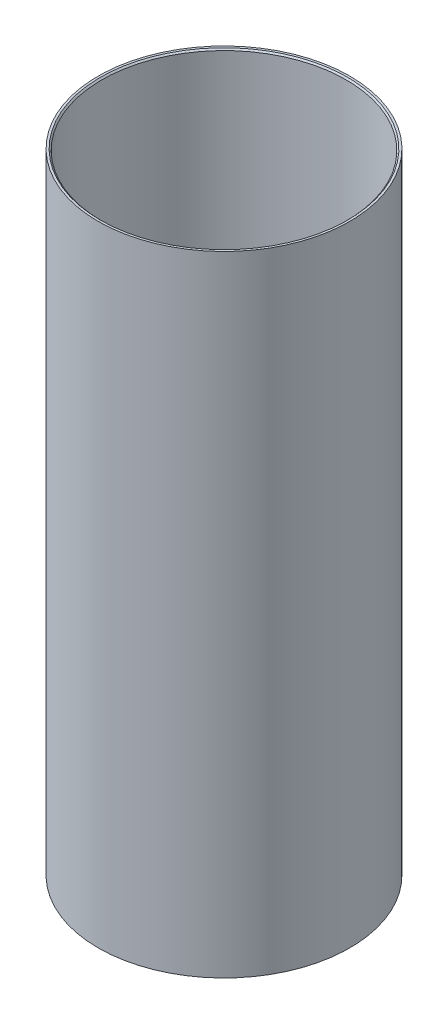
ISO-10303-21;
HEADER;
FILE_DESCRIPTION(('STEP AP214'),'2;1');
FILE_NAME('part.step','',(''),(''),'','','');
FILE_SCHEMA(('AUTOMOTIVE_DESIGN { 1 0 10303 214 1 1 1 1 }'));
ENDSEC;
DATA;
#1=APPLICATION_CONTEXT('core data for automotive mechanical design processes');
#2=APPLICATION_PROTOCOL_DEFINITION('international standard','automotive_design',2000,#1);
#3=PRODUCT_CONTEXT('',#1,'mechanical');
#4=PRODUCT('Part','Part','',(#3));
#5=PRODUCT_RELATED_PRODUCT_CATEGORY('part','',(#4));
#6=PRODUCT_DEFINITION_FORMATION('','',#4);
#7=PRODUCT_DEFINITION_CONTEXT('part definition',#1,'design');
#8=PRODUCT_DEFINITION('design','',#6,#7);
#9=PRODUCT_DEFINITION_SHAPE('','',#8);
#10=(LENGTH_UNIT() NAMED_UNIT(*) SI_UNIT(.MILLI.,.METRE.));
#11=(NAMED_UNIT(*) PLANE_ANGLE_UNIT() SI_UNIT($,.RADIAN.));
#12=(NAMED_UNIT(*) SI_UNIT($,.STERADIAN.) SOLID_ANGLE_UNIT());
#13=UNCERTAINTY_MEASURE_WITH_UNIT(LENGTH_MEASURE(1.E-05),#10,'distance_accuracy_value','');
#14=(GEOMETRIC_REPRESENTATION_CONTEXT(3) GLOBAL_UNCERTAINTY_ASSIGNED_CONTEXT((#13)) GLOBAL_UNIT_ASSIGNED_CONTEXT((#10,
#11,#12)) REPRESENTATION_CONTEXT('',''));
#15=CARTESIAN_POINT('',(0.,0.,0.));
#16=DIRECTION('',(0.,0.,1.));
#17=DIRECTION('',(1.,0.,0.));
#18=AXIS2_PLACEMENT_3D('',#15,#16,#17);
#19=CARTESIAN_POINT('',(0.,87.5,0.));
#20=DIRECTION('',(0.,-1.,0.));
#21=DIRECTION('',(0.,0.,-1.));
#22=AXIS2_PLACEMENT_3D('',#19,#20,#21);
#23=CYLINDRICAL_SURFACE('',#22,17.5);
#24=CARTESIAN_POINT('',(0.,87.5,0.));
#25=DIRECTION('',(0.,1.,0.));
#26=DIRECTION('',(0.,0.,1.));
#27=AXIS2_PLACEMENT_3D('',#24,#25,#26);
#28=CIRCLE('',#27,17.5);
#29=CARTESIAN_POINT('',(0.,87.5,17.5));
#30=VERTEX_POINT('',#29);
#31=EDGE_CURVE('E66',#30,#30,#28,.T.);
#32=ORIENTED_EDGE('',*,*,#31,.F.);
#33=EDGE_LOOP('',(#32));
#34=FACE_BOUND('',#33,.T.);
#35=CARTESIAN_POINT('',(0.,0.,0.));
#36=DIRECTION('',(0.,1.,0.));
#37=DIRECTION('',(0.,0.,1.));
#38=AXIS2_PLACEMENT_3D('',#35,#36,#37);
#39=CIRCLE('',#38,17.5);
#40=CARTESIAN_POINT('',(0.,0.,17.5));
#41=VERTEX_POINT('',#40);
#42=EDGE_CURVE('E67',#41,#41,#39,.T.);
#43=ORIENTED_EDGE('',*,*,#42,.T.);
#44=EDGE_LOOP('',(#43));
#45=FACE_BOUND('',#44,.T.);
#46=ADVANCED_FACE('F41',(#34,#45),#23,.T.);
#47=CARTESIAN_POINT('',(0.,87.5,0.));
#48=DIRECTION('',(0.,1.,0.));
#49=DIRECTION('',(0.,0.,1.));
#50=AXIS2_PLACEMENT_3D('',#47,#48,#49);
#51=PLANE('',#50);
#52=CARTESIAN_POINT('',(0.,87.5,0.));
#53=DIRECTION('',(0.,1.,0.));
#54=DIRECTION('',(0.,0.,1.));
#55=AXIS2_PLACEMENT_3D('',#52,#53,#54);
#56=CIRCLE('',#55,17.2);
#57=CARTESIAN_POINT('',(0.,87.5,17.2));
#58=VERTEX_POINT('',#57);
#59=EDGE_CURVE('E50',#58,#58,#56,.F.);
#60=ORIENTED_EDGE('',*,*,#59,.T.);
#61=EDGE_LOOP('',(#60));
#62=FACE_BOUND('',#61,.T.);
#63=ORIENTED_EDGE('',*,*,#31,.T.);
#64=EDGE_LOOP('',(#63));
#65=FACE_BOUND('',#64,.T.);
#66=ADVANCED_FACE('F75',(#62,#65),#51,.T.);
#67=CARTESIAN_POINT('',(0.,0.,0.));
#68=DIRECTION('',(0.,1.,0.));
#69=DIRECTION('',(0.,0.,1.));
#70=AXIS2_PLACEMENT_3D('',#67,#68,#69);
#71=PLANE('',#70);
#72=CARTESIAN_POINT('',(0.,0.,0.));
#73=DIRECTION('',(0.,1.,0.));
#74=DIRECTION('',(0.,0.,1.));
#75=AXIS2_PLACEMENT_3D('',#72,#73,#74);
#76=CIRCLE('',#75,17.2);
#77=CARTESIAN_POINT('',(0.,0.,17.2));
#78=VERTEX_POINT('',#77);
#79=EDGE_CURVE('E10',#78,#78,#76,.T.);
#80=ORIENTED_EDGE('',*,*,#79,.T.);
#81=EDGE_LOOP('',(#80));
#82=FACE_BOUND('',#81,.T.);
#83=ORIENTED_EDGE('',*,*,#42,.F.);
#84=EDGE_LOOP('',(#83));
#85=FACE_BOUND('',#84,.T.);
#86=ADVANCED_FACE('F82',(#82,#85),#71,.F.);
#87=CARTESIAN_POINT('',(0.,0.,0.));
#88=DIRECTION('',(0.,1.,0.));
#89=DIRECTION('',(0.,0.,1.));
#90=AXIS2_PLACEMENT_3D('',#87,#88,#89);
#91=CYLINDRICAL_SURFACE('',#90,17.);
#92=CARTESIAN_POINT('',(0.,87.3,0.));
#93=DIRECTION('',(0.,1.,0.));
#94=DIRECTION('',(0.,0.,1.));
#95=AXIS2_PLACEMENT_3D('',#92,#93,#94);
#96=CIRCLE('',#95,17.);
#97=CARTESIAN_POINT('',(0.,87.3,17.));
#98=VERTEX_POINT('',#97);
#99=EDGE_CURVE('E55',#98,#98,#96,.T.);
#100=ORIENTED_EDGE('',*,*,#99,.T.);
#101=EDGE_LOOP('',(#100));
#102=FACE_BOUND('',#101,.T.);
#103=CARTESIAN_POINT('',(0.,0.200000000000009,0.));
#104=DIRECTION('',(0.,1.,0.));
#105=DIRECTION('',(0.,0.,1.));
#106=AXIS2_PLACEMENT_3D('',#103,#104,#105);
#107=CIRCLE('',#106,17.);
#108=CARTESIAN_POINT('',(0.,0.200000000000009,17.));
#109=VERTEX_POINT('',#108);
#110=EDGE_CURVE('E60',#109,#109,#107,.F.);
#111=ORIENTED_EDGE('',*,*,#110,.T.);
#112=EDGE_LOOP('',(#111));
#113=FACE_BOUND('',#112,.T.);
#114=ADVANCED_FACE('F84',(#102,#113),#91,.F.);
#115=CARTESIAN_POINT('',(0.,87.3,0.));
#116=DIRECTION('',(0.,1.,0.));
#117=DIRECTION('',(0.,0.,1.));
#118=AXIS2_PLACEMENT_3D('',#115,#116,#117);
#119=CONICAL_SURFACE('',#118,17.,0.785398163397448);
#120=ORIENTED_EDGE('',*,*,#59,.F.);
#121=EDGE_LOOP('',(#120));
#122=FACE_BOUND('',#121,.T.);
#123=ORIENTED_EDGE('',*,*,#99,.F.);
#124=EDGE_LOOP('',(#123));
#125=FACE_BOUND('',#124,.T.);
#126=ADVANCED_FACE('F90',(#122,#125),#119,.F.);
#127=CARTESIAN_POINT('',(0.,0.,0.));
#128=DIRECTION('',(0.,-1.,0.));
#129=DIRECTION('',(0.,0.,-1.));
#130=AXIS2_PLACEMENT_3D('',#127,#128,#129);
#131=CONICAL_SURFACE('',#130,17.2,0.785398163397422);
#132=ORIENTED_EDGE('',*,*,#110,.F.);
#133=EDGE_LOOP('',(#132));
#134=FACE_BOUND('',#133,.T.);
#135=ORIENTED_EDGE('',*,*,#79,.F.);
#136=EDGE_LOOP('',(#135));
#137=FACE_BOUND('',#136,.T.);
#138=ADVANCED_FACE('F44',(#134,#137),#131,.F.);
#139=CLOSED_SHELL('',(#46,#66,#86,#114,#126,#138));
#140=MANIFOLD_SOLID_BREP('B2',#139);
#141=ADVANCED_BREP_SHAPE_REPRESENTATION('',(#18,#140),#14);
#142=SHAPE_DEFINITION_REPRESENTATION(#9,#141);
ENDSEC;
END-ISO-10303-21;
